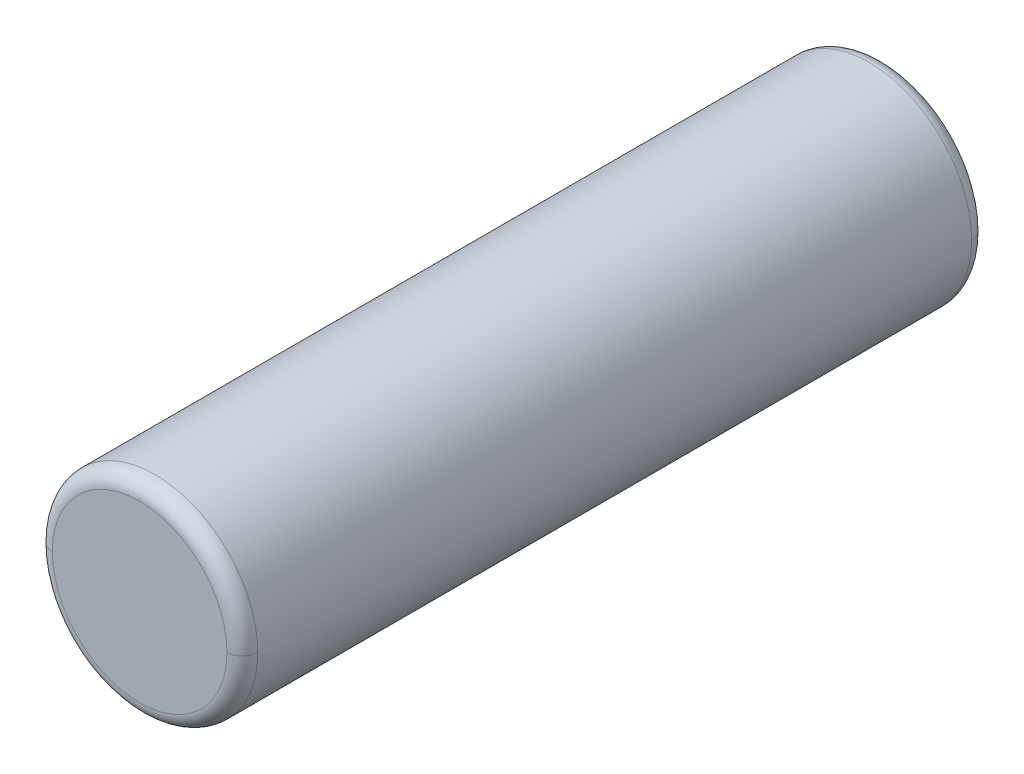
ISO-10303-21;
HEADER;
FILE_DESCRIPTION(('STEP AP214'),'2;1');
FILE_NAME('part.step','',(''),(''),'','','');
FILE_SCHEMA(('AUTOMOTIVE_DESIGN { 1 0 10303 214 1 1 1 1 }'));
ENDSEC;
DATA;
#1=APPLICATION_CONTEXT('core data for automotive mechanical design processes');
#2=APPLICATION_PROTOCOL_DEFINITION('international standard','automotive_design',2000,#1);
#3=PRODUCT_CONTEXT('',#1,'mechanical');
#4=PRODUCT('Part','Part','',(#3));
#5=PRODUCT_RELATED_PRODUCT_CATEGORY('part','',(#4));
#6=PRODUCT_DEFINITION_FORMATION('','',#4);
#7=PRODUCT_DEFINITION_CONTEXT('part definition',#1,'design');
#8=PRODUCT_DEFINITION('design','',#6,#7);
#9=PRODUCT_DEFINITION_SHAPE('','',#8);
#10=(LENGTH_UNIT() NAMED_UNIT(*) SI_UNIT(.MILLI.,.METRE.));
#11=(NAMED_UNIT(*) PLANE_ANGLE_UNIT() SI_UNIT($,.RADIAN.));
#12=(NAMED_UNIT(*) SI_UNIT($,.STERADIAN.) SOLID_ANGLE_UNIT());
#13=UNCERTAINTY_MEASURE_WITH_UNIT(LENGTH_MEASURE(1.E-05),#10,'distance_accuracy_value','');
#14=(GEOMETRIC_REPRESENTATION_CONTEXT(3) GLOBAL_UNCERTAINTY_ASSIGNED_CONTEXT((#13)) GLOBAL_UNIT_ASSIGNED_CONTEXT((#10,
#11,#12)) REPRESENTATION_CONTEXT('',''));
#15=CARTESIAN_POINT('',(0.,0.,0.));
#16=DIRECTION('',(0.,0.,1.));
#17=DIRECTION('',(1.,0.,0.));
#18=AXIS2_PLACEMENT_3D('',#15,#16,#17);
#19=CARTESIAN_POINT('',(0.,0.,14.5));
#20=DIRECTION('',(0.,0.,1.));
#21=DIRECTION('',(1.,0.,0.));
#22=AXIS2_PLACEMENT_3D('',#19,#20,#21);
#23=PLANE('',#22);
#24=CARTESIAN_POINT('',(0.,-2.28043375454604E-12,14.5000000015997));
#25=DIRECTION('',(0.,1.52229627482E-09,-1.));
#26=DIRECTION('',(1.,-2.67302663624685E-10,0.));
#27=AXIS2_PLACEMENT_3D('',#24,#25,#26);
#28=CIRCLE('',#27,1.7000000001345);
#29=CARTESIAN_POINT('',(1.70000000014525,-1.66238889135848E-10,14.5000000010665));
#30=VERTEX_POINT('',#29);
#31=CARTESIAN_POINT('',(-1.70000000014525,9.25211867436913E-11,14.5000000010665));
#32=VERTEX_POINT('',#31);
#33=EDGE_CURVE('E67',#30,#32,#28,.T.);
#34=ORIENTED_EDGE('',*,*,#33,.F.);
#35=CARTESIAN_POINT('',(0.,2.28043375454604E-12,14.5000000015997));
#36=DIRECTION('',(0.,-1.52229627482E-09,-1.));
#37=DIRECTION('',(-1.,2.33383129776337E-10,0.));
#38=AXIS2_PLACEMENT_3D('',#35,#36,#37);
#39=CIRCLE('',#38,1.7000000001345);
#40=EDGE_CURVE('E62',#32,#30,#39,.T.);
#41=ORIENTED_EDGE('',*,*,#40,.F.);
#42=EDGE_LOOP('',(#34,#41));
#43=FACE_BOUND('',#42,.T.);
#44=ADVANCED_FACE('F16',(#43),#23,.T.);
#45=CARTESIAN_POINT('',(0.,0.,0.));
#46=DIRECTION('',(0.,0.,1.));
#47=DIRECTION('',(1.,0.,0.));
#48=AXIS2_PLACEMENT_3D('',#45,#46,#47);
#49=PLANE('',#48);
#50=CARTESIAN_POINT('',(0.,2.28043375454705E-12,-1.60010004378319E-09));
#51=DIRECTION('',(0.,-1.52229627482E-09,1.));
#52=DIRECTION('',(1.,6.87615243048198E-11,0.));
#53=AXIS2_PLACEMENT_3D('',#50,#51,#52);
#54=CIRCLE('',#53,1.700000000156);
#55=CARTESIAN_POINT('',(1.7000000001517,1.83463453681861E-11,-9.60060026304111E-10));
#56=VERTEX_POINT('',#55);
#57=CARTESIAN_POINT('',(-1.70000000015242,-3.51510441692792E-11,-1.06673336257912E-09));
#58=VERTEX_POINT('',#57);
#59=EDGE_CURVE('E116',#56,#58,#54,.T.);
#60=ORIENTED_EDGE('',*,*,#59,.F.);
#61=CARTESIAN_POINT('',(0.,-2.28043375454705E-12,-1.60010004378319E-09));
#62=DIRECTION('',(0.,1.52229627482E-09,1.));
#63=DIRECTION('',(-1.,-6.87615243048198E-11,0.));
#64=AXIS2_PLACEMENT_3D('',#61,#62,#63);
#65=CIRCLE('',#64,1.700000000156);
#66=EDGE_CURVE('E146',#58,#56,#65,.T.);
#67=ORIENTED_EDGE('',*,*,#66,.F.);
#68=EDGE_LOOP('',(#60,#67));
#69=FACE_BOUND('',#68,.T.);
#70=ADVANCED_FACE('F130',(#69),#49,.F.);
#71=CARTESIAN_POINT('',(0.,-4.544084492238E-10,0.2999999987496));
#72=DIRECTION('',(0.,1.52229627482E-09,-1.));
#73=DIRECTION('',(1.,6.876127937546E-11,0.));
#74=AXIS2_PLACEMENT_3D('',#71,#72,#73);
#75=TOROIDAL_SURFACE('',#74,1.700000000113,0.3000000003497);
#76=CARTESIAN_POINT('',(1.700000000113,4.49828090974819E-10,0.2999999987496));
#77=DIRECTION('',(-2.69432838157455E-12,-1.,1.52229627482E-09));
#78=DIRECTION('',(1.,-2.69432838157467E-12,0.));
#79=AXIS2_PLACEMENT_3D('',#76,#77,#78);
#80=CIRCLE('',#79,0.3000000003497);
#81=CARTESIAN_POINT('',(2.00000000011568,2.25929757080216E-10,0.299999998749601));
#82=VERTEX_POINT('',#81);
#83=EDGE_CURVE('E183',#56,#82,#80,.T.);
#84=ORIENTED_EDGE('',*,*,#83,.F.);
#85=ORIENTED_EDGE('',*,*,#59,.T.);
#86=CARTESIAN_POINT('',(-1.700000000113,-4.49828845926476E-10,0.2999999987496));
#87=DIRECTION('',(2.6938842923647E-12,1.,1.52229627482E-09));
#88=DIRECTION('',(-1.,2.69388429236482E-12,0.));
#89=AXIS2_PLACEMENT_3D('',#86,#87,#88);
#90=CIRCLE('',#89,0.3000000003497);
#91=CARTESIAN_POINT('',(-2.00000000023135,-2.24510340318912E-10,0.2999999987496));
#92=VERTEX_POINT('',#91);
#93=EDGE_CURVE('E75',#92,#58,#90,.F.);
#94=ORIENTED_EDGE('',*,*,#93,.F.);
#95=CARTESIAN_POINT('',(0.,0.,0.299999998749601));
#96=DIRECTION('',(0.,0.,-1.));
#97=DIRECTION('',(-1.,0.,0.));
#98=AXIS2_PLACEMENT_3D('',#95,#96,#97);
#99=CIRCLE('',#98,2.);
#100=EDGE_CURVE('E35',#82,#92,#99,.F.);
#101=ORIENTED_EDGE('',*,*,#100,.F.);
#102=EDGE_LOOP('',(#84,#85,#94,#101));
#103=FACE_BOUND('',#102,.T.);
#104=ADVANCED_FACE('F122',(#103),#75,.T.);
#105=CARTESIAN_POINT('',(0.,-4.544084492238E-10,14.20000000125));
#106=DIRECTION('',(0.,-1.52229627482E-09,-1.));
#107=DIRECTION('',(1.,6.876127937546E-11,0.));
#108=AXIS2_PLACEMENT_3D('',#105,#106,#107);
#109=TOROIDAL_SURFACE('',#108,1.700000000113,0.3000000003497);
#110=CARTESIAN_POINT('',(1.700000000113,0.,14.20000000125));
#111=DIRECTION('',(-2.67302663624685E-10,-1.,-1.52229627482E-09));
#112=DIRECTION('',(1.,-2.67302663624685E-10,0.));
#113=AXIS2_PLACEMENT_3D('',#110,#111,#112);
#114=CIRCLE('',#113,0.3000000003497);
#115=CARTESIAN_POINT('',(2.00000000023135,-8.01968773262628E-11,14.20000000075));
#116=VERTEX_POINT('',#115);
#117=EDGE_CURVE('E59',#116,#30,#114,.T.);
#118=ORIENTED_EDGE('',*,*,#117,.F.);
#119=CARTESIAN_POINT('',(0.,0.,14.20000000025));
#120=DIRECTION('',(0.,0.,-1.));
#121=DIRECTION('',(-1.,0.,0.));
#122=AXIS2_PLACEMENT_3D('',#119,#120,#121);
#123=CIRCLE('',#122,2.);
#124=CARTESIAN_POINT('',(-2.00000000023135,6.17890521843055E-12,14.20000000075));
#125=VERTEX_POINT('',#124);
#126=EDGE_CURVE('E56',#125,#116,#123,.T.);
#127=ORIENTED_EDGE('',*,*,#126,.F.);
#128=CARTESIAN_POINT('',(-1.700000000113,-5.76571285776546E-11,14.20000000125));
#129=DIRECTION('',(2.33383129776337E-10,1.,-1.52229627482E-09));
#130=DIRECTION('',(-1.,2.33383129776337E-10,0.));
#131=AXIS2_PLACEMENT_3D('',#128,#129,#130);
#132=CIRCLE('',#131,0.3000000003497);
#133=EDGE_CURVE('E70',#32,#125,#132,.F.);
#134=ORIENTED_EDGE('',*,*,#133,.F.);
#135=ORIENTED_EDGE('',*,*,#40,.T.);
#136=EDGE_LOOP('',(#118,#127,#134,#135));
#137=FACE_BOUND('',#136,.T.);
#138=ADVANCED_FACE('F61',(#137),#109,.T.);
#139=CARTESIAN_POINT('',(0.,4.544084492238E-10,14.20000000125));
#140=DIRECTION('',(0.,1.52229627482E-09,-1.));
#141=DIRECTION('',(-1.,-6.876127937546E-11,0.));
#142=AXIS2_PLACEMENT_3D('',#139,#140,#141);
#143=TOROIDAL_SURFACE('',#142,1.700000000113,0.3000000003497);
#144=ORIENTED_EDGE('',*,*,#33,.T.);
#145=ORIENTED_EDGE('',*,*,#133,.T.);
#146=CARTESIAN_POINT('',(0.,0.,14.20000000025));
#147=DIRECTION('',(0.,0.,-1.));
#148=DIRECTION('',(-1.,0.,0.));
#149=AXIS2_PLACEMENT_3D('',#146,#147,#148);
#150=CIRCLE('',#149,2.);
#151=EDGE_CURVE('E26',#116,#125,#150,.T.);
#152=ORIENTED_EDGE('',*,*,#151,.F.);
#153=ORIENTED_EDGE('',*,*,#117,.T.);
#154=EDGE_LOOP('',(#144,#145,#152,#153));
#155=FACE_BOUND('',#154,.T.);
#156=ADVANCED_FACE('F69',(#155),#143,.T.);
#157=CARTESIAN_POINT('',(0.,4.544084492238E-10,0.2999999987496));
#158=DIRECTION('',(0.,-1.52229627482E-09,-1.));
#159=DIRECTION('',(-1.,-6.876127937546E-11,0.));
#160=AXIS2_PLACEMENT_3D('',#157,#158,#159);
#161=TOROIDAL_SURFACE('',#160,1.700000000113,0.3000000003497);
#162=CARTESIAN_POINT('',(0.,0.,0.299999998749601));
#163=DIRECTION('',(0.,0.,-1.));
#164=DIRECTION('',(-1.,0.,0.));
#165=AXIS2_PLACEMENT_3D('',#162,#163,#164);
#166=CIRCLE('',#165,2.);
#167=EDGE_CURVE('E11',#92,#82,#166,.F.);
#168=ORIENTED_EDGE('',*,*,#167,.F.);
#169=ORIENTED_EDGE('',*,*,#93,.T.);
#170=ORIENTED_EDGE('',*,*,#66,.T.);
#171=ORIENTED_EDGE('',*,*,#83,.T.);
#172=EDGE_LOOP('',(#168,#169,#170,#171));
#173=FACE_BOUND('',#172,.T.);
#174=ADVANCED_FACE('F89',(#173),#161,.T.);
#175=CARTESIAN_POINT('',(0.,0.,14.2));
#176=DIRECTION('',(0.,0.,-1.));
#177=DIRECTION('',(-1.,0.,0.));
#178=AXIS2_PLACEMENT_3D('',#175,#176,#177);
#179=CYLINDRICAL_SURFACE('',#178,2.);
#180=ORIENTED_EDGE('',*,*,#100,.T.);
#181=ORIENTED_EDGE('',*,*,#167,.T.);
#182=EDGE_LOOP('',(#180,#181));
#183=FACE_BOUND('',#182,.T.);
#184=ORIENTED_EDGE('',*,*,#151,.T.);
#185=ORIENTED_EDGE('',*,*,#126,.T.);
#186=EDGE_LOOP('',(#184,#185));
#187=FACE_BOUND('',#186,.T.);
#188=ADVANCED_FACE('F73',(#183,#187),#179,.T.);
#189=CLOSED_SHELL('',(#44,#70,#104,#138,#156,#174,#188));
#190=MANIFOLD_SOLID_BREP('B1',#189);
#191=ADVANCED_BREP_SHAPE_REPRESENTATION('',(#18,#190),#14);
#192=SHAPE_DEFINITION_REPRESENTATION(#9,#191);
ENDSEC;
END-ISO-10303-21;
